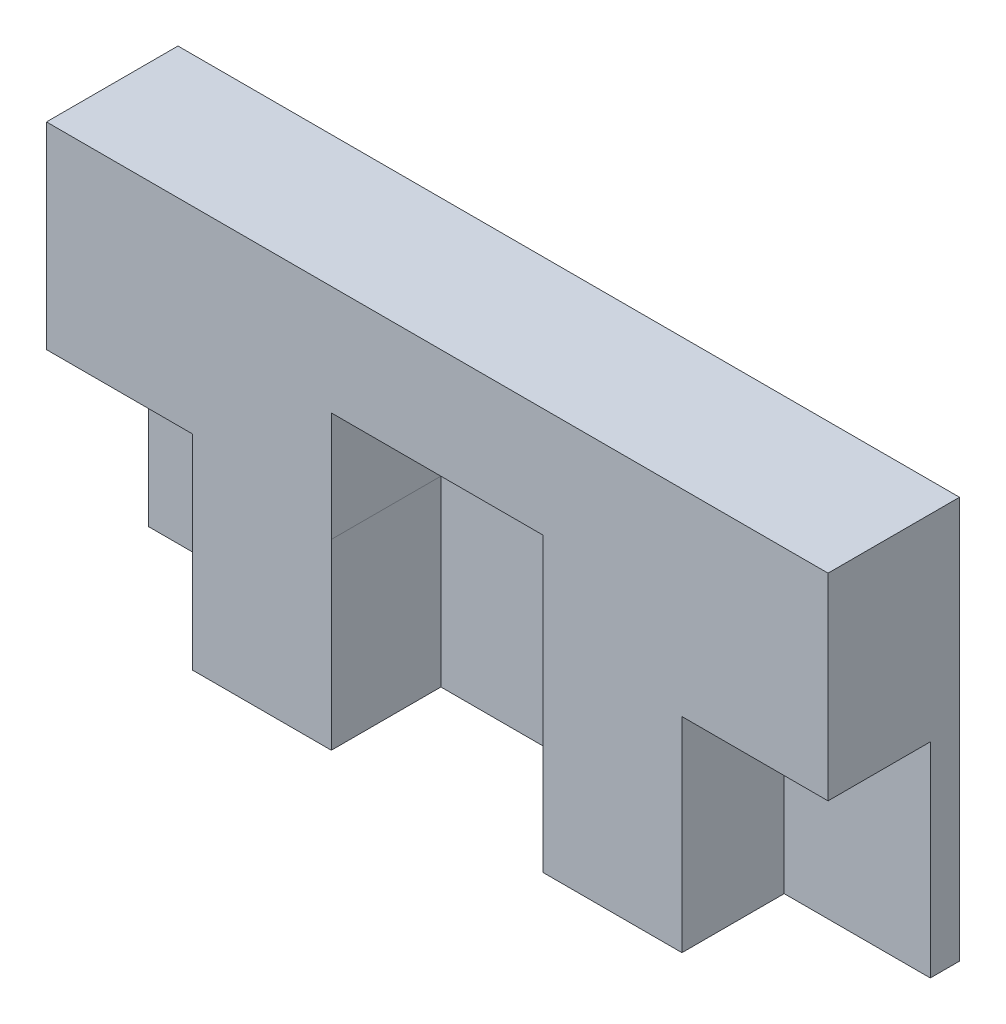
ISO-10303-21;
HEADER;
FILE_DESCRIPTION(('STEP AP214'),'2;1');
FILE_NAME('part.step','',(''),(''),'','','');
FILE_SCHEMA(('AUTOMOTIVE_DESIGN { 1 0 10303 214 1 1 1 1 }'));
ENDSEC;
DATA;
#1=APPLICATION_CONTEXT('core data for automotive mechanical design processes');
#2=APPLICATION_PROTOCOL_DEFINITION('international standard','automotive_design',2000,#1);
#3=PRODUCT_CONTEXT('',#1,'mechanical');
#4=PRODUCT('Part','Part','',(#3));
#5=PRODUCT_RELATED_PRODUCT_CATEGORY('part','',(#4));
#6=PRODUCT_DEFINITION_FORMATION('','',#4);
#7=PRODUCT_DEFINITION_CONTEXT('part definition',#1,'design');
#8=PRODUCT_DEFINITION('design','',#6,#7);
#9=PRODUCT_DEFINITION_SHAPE('','',#8);
#10=(LENGTH_UNIT() NAMED_UNIT(*) SI_UNIT(.MILLI.,.METRE.));
#11=(NAMED_UNIT(*) PLANE_ANGLE_UNIT() SI_UNIT($,.RADIAN.));
#12=(NAMED_UNIT(*) SI_UNIT($,.STERADIAN.) SOLID_ANGLE_UNIT());
#13=UNCERTAINTY_MEASURE_WITH_UNIT(LENGTH_MEASURE(1.E-05),#10,'distance_accuracy_value','');
#14=(GEOMETRIC_REPRESENTATION_CONTEXT(3) GLOBAL_UNCERTAINTY_ASSIGNED_CONTEXT((#13)) GLOBAL_UNIT_ASSIGNED_CONTEXT((#10,
#11,#12)) REPRESENTATION_CONTEXT('',''));
#15=CARTESIAN_POINT('',(0.,0.,0.));
#16=DIRECTION('',(0.,0.,1.));
#17=DIRECTION('',(1.,0.,0.));
#18=AXIS2_PLACEMENT_3D('',#15,#16,#17);
#19=CARTESIAN_POINT('',(-339.725,349.25,0.));
#20=DIRECTION('',(1.,0.,0.));
#21=DIRECTION('',(0.,0.,-1.));
#22=AXIS2_PLACEMENT_3D('',#19,#20,#21);
#23=PLANE('',#22);
#24=DIRECTION('',(0.,-1.,0.));
#25=VECTOR('',#24,1.);
#26=CARTESIAN_POINT('',(-339.725,177.8,-88.9));
#27=LINE('',#26,#25);
#28=CARTESIAN_POINT('',(-339.725,177.8,-88.9));
#29=VERTEX_POINT('',#28);
#30=CARTESIAN_POINT('',(-339.725,0.,-88.9));
#31=VERTEX_POINT('',#30);
#32=EDGE_CURVE('E60',#29,#31,#27,.T.);
#33=ORIENTED_EDGE('',*,*,#32,.F.);
#34=DIRECTION('',(0.,0.,1.));
#35=VECTOR('',#34,1.);
#36=CARTESIAN_POINT('',(-339.725,177.8,0.));
#37=LINE('',#36,#35);
#38=CARTESIAN_POINT('',(-339.725,177.8,0.));
#39=VERTEX_POINT('',#38);
#40=EDGE_CURVE('E151',#29,#39,#37,.T.);
#41=ORIENTED_EDGE('',*,*,#40,.T.);
#42=DIRECTION('',(0.,-1.,0.));
#43=VECTOR('',#42,1.);
#44=CARTESIAN_POINT('',(-339.725,349.25,0.));
#45=LINE('',#44,#43);
#46=CARTESIAN_POINT('',(-339.725,349.25,0.));
#47=VERTEX_POINT('',#46);
#48=EDGE_CURVE('E11',#47,#39,#45,.T.);
#49=ORIENTED_EDGE('',*,*,#48,.F.);
#50=DIRECTION('',(0.,0.,1.));
#51=VECTOR('',#50,1.);
#52=CARTESIAN_POINT('',(-339.725,349.25,0.));
#53=LINE('',#52,#51);
#54=CARTESIAN_POINT('',(-339.725,349.25,-114.3));
#55=VERTEX_POINT('',#54);
#56=EDGE_CURVE('E171',#55,#47,#53,.T.);
#57=ORIENTED_EDGE('',*,*,#56,.F.);
#58=DIRECTION('',(0.,-1.,0.));
#59=VECTOR('',#58,1.);
#60=CARTESIAN_POINT('',(-339.725,349.25,-114.3));
#61=LINE('',#60,#59);
#62=CARTESIAN_POINT('',(-339.725,0.,-114.3));
#63=VERTEX_POINT('',#62);
#64=EDGE_CURVE('E188',#55,#63,#61,.T.);
#65=ORIENTED_EDGE('',*,*,#64,.T.);
#66=DIRECTION('',(0.,0.,1.));
#67=VECTOR('',#66,1.);
#68=CARTESIAN_POINT('',(-339.725,0.,0.));
#69=LINE('',#68,#67);
#70=EDGE_CURVE('E189',#63,#31,#69,.T.);
#71=ORIENTED_EDGE('',*,*,#70,.T.);
#72=EDGE_LOOP('',(#33,#41,#49,#57,#65,#71));
#73=FACE_BOUND('',#72,.T.);
#74=ADVANCED_FACE('F38',(#73),#23,.F.);
#75=CARTESIAN_POINT('',(-339.725,349.25,0.));
#76=DIRECTION('',(0.,0.,-1.));
#77=DIRECTION('',(-1.,0.,0.));
#78=AXIS2_PLACEMENT_3D('',#75,#76,#77);
#79=PLANE('',#78);
#80=DIRECTION('',(0.,-1.,0.));
#81=VECTOR('',#80,1.);
#82=CARTESIAN_POINT('',(-212.725,177.8,0.));
#83=LINE('',#82,#81);
#84=CARTESIAN_POINT('',(-212.725,177.8,0.));
#85=VERTEX_POINT('',#84);
#86=CARTESIAN_POINT('',(-212.725,0.,0.));
#87=VERTEX_POINT('',#86);
#88=EDGE_CURVE('E225',#85,#87,#83,.T.);
#89=ORIENTED_EDGE('',*,*,#88,.T.);
#90=DIRECTION('',(1.,0.,0.));
#91=VECTOR('',#90,1.);
#92=CARTESIAN_POINT('',(-339.725,0.,0.));
#93=LINE('',#92,#91);
#94=CARTESIAN_POINT('',(-92.075,0.,0.));
#95=VERTEX_POINT('',#94);
#96=EDGE_CURVE('E193',#87,#95,#93,.T.);
#97=ORIENTED_EDGE('',*,*,#96,.T.);
#98=DIRECTION('',(0.,1.,0.));
#99=VECTOR('',#98,1.);
#100=CARTESIAN_POINT('',(-92.075,-1.5875,0.));
#101=LINE('',#100,#99);
#102=CARTESIAN_POINT('',(-92.075,158.75,-1.11022302462516E-13));
#103=VERTEX_POINT('',#102);
#104=EDGE_CURVE('E274',#95,#103,#101,.T.);
#105=ORIENTED_EDGE('',*,*,#104,.T.);
#106=DIRECTION('',(0.,-1.,0.));
#107=VECTOR('',#106,1.);
#108=CARTESIAN_POINT('',(-92.075,158.75,0.));
#109=LINE('',#108,#107);
#110=CARTESIAN_POINT('',(-92.075,254.,0.));
#111=VERTEX_POINT('',#110);
#112=EDGE_CURVE('E192',#111,#103,#109,.T.);
#113=ORIENTED_EDGE('',*,*,#112,.F.);
#114=DIRECTION('',(-1.,0.,0.));
#115=VECTOR('',#114,1.);
#116=CARTESIAN_POINT('',(-92.075,254.,0.));
#117=LINE('',#116,#115);
#118=CARTESIAN_POINT('',(92.075,254.,0.));
#119=VERTEX_POINT('',#118);
#120=EDGE_CURVE('E245',#119,#111,#117,.T.);
#121=ORIENTED_EDGE('',*,*,#120,.F.);
#122=DIRECTION('',(0.,1.,0.));
#123=VECTOR('',#122,1.);
#124=CARTESIAN_POINT('',(92.075,158.75,0.));
#125=LINE('',#124,#123);
#126=CARTESIAN_POINT('',(92.075,158.75,0.));
#127=VERTEX_POINT('',#126);
#128=EDGE_CURVE('E249',#127,#119,#125,.T.);
#129=ORIENTED_EDGE('',*,*,#128,.F.);
#130=DIRECTION('',(0.,1.,0.));
#131=VECTOR('',#130,1.);
#132=CARTESIAN_POINT('',(92.075,-1.5875,0.));
#133=LINE('',#132,#131);
#134=CARTESIAN_POINT('',(92.075,0.,0.));
#135=VERTEX_POINT('',#134);
#136=EDGE_CURVE('E183',#135,#127,#133,.T.);
#137=ORIENTED_EDGE('',*,*,#136,.F.);
#138=CARTESIAN_POINT('',(212.725,0.,0.));
#139=VERTEX_POINT('',#138);
#140=EDGE_CURVE('E191',#135,#139,#93,.T.);
#141=ORIENTED_EDGE('',*,*,#140,.T.);
#142=DIRECTION('',(0.,-1.,0.));
#143=VECTOR('',#142,1.);
#144=CARTESIAN_POINT('',(212.725,177.8,0.));
#145=LINE('',#144,#143);
#146=CARTESIAN_POINT('',(212.725,177.8,0.));
#147=VERTEX_POINT('',#146);
#148=EDGE_CURVE('E52',#147,#139,#145,.T.);
#149=ORIENTED_EDGE('',*,*,#148,.F.);
#150=DIRECTION('',(1.,0.,0.));
#151=VECTOR('',#150,1.);
#152=CARTESIAN_POINT('',(339.725,177.8,0.));
#153=LINE('',#152,#151);
#154=CARTESIAN_POINT('',(339.725,177.8,0.));
#155=VERTEX_POINT('',#154);
#156=EDGE_CURVE('E234',#147,#155,#153,.T.);
#157=ORIENTED_EDGE('',*,*,#156,.T.);
#158=DIRECTION('',(0.,-1.,0.));
#159=VECTOR('',#158,1.);
#160=CARTESIAN_POINT('',(339.725,349.25,0.));
#161=LINE('',#160,#159);
#162=CARTESIAN_POINT('',(339.725,349.25,0.));
#163=VERTEX_POINT('',#162);
#164=EDGE_CURVE('E45',#163,#155,#161,.T.);
#165=ORIENTED_EDGE('',*,*,#164,.F.);
#166=DIRECTION('',(1.,0.,0.));
#167=VECTOR('',#166,1.);
#168=CARTESIAN_POINT('',(-339.725,349.25,0.));
#169=LINE('',#168,#167);
#170=EDGE_CURVE('E164',#47,#163,#169,.T.);
#171=ORIENTED_EDGE('',*,*,#170,.F.);
#172=ORIENTED_EDGE('',*,*,#48,.T.);
#173=DIRECTION('',(1.,0.,0.));
#174=VECTOR('',#173,1.);
#175=CARTESIAN_POINT('',(-339.725,177.8,0.));
#176=LINE('',#175,#174);
#177=EDGE_CURVE('E147',#39,#85,#176,.T.);
#178=ORIENTED_EDGE('',*,*,#177,.T.);
#179=EDGE_LOOP('',(#89,#97,#105,#113,#121,#129,#137,#141,#149,#157,#165,#171,#172,#178));
#180=FACE_BOUND('',#179,.T.);
#181=ADVANCED_FACE('F162',(#180),#79,.F.);
#182=CARTESIAN_POINT('',(339.725,349.25,0.));
#183=DIRECTION('',(-1.,0.,0.));
#184=DIRECTION('',(0.,0.,1.));
#185=AXIS2_PLACEMENT_3D('',#182,#183,#184);
#186=PLANE('',#185);
#187=DIRECTION('',(0.,-1.,0.));
#188=VECTOR('',#187,1.);
#189=CARTESIAN_POINT('',(339.725,177.8,-88.8999999999999));
#190=LINE('',#189,#188);
#191=CARTESIAN_POINT('',(339.725,177.8,-88.8999999999999));
#192=VERTEX_POINT('',#191);
#193=CARTESIAN_POINT('',(339.725,0.,-88.8999999999999));
#194=VERTEX_POINT('',#193);
#195=EDGE_CURVE('E217',#192,#194,#190,.T.);
#196=ORIENTED_EDGE('',*,*,#195,.T.);
#197=DIRECTION('',(0.,0.,-1.));
#198=VECTOR('',#197,1.);
#199=CARTESIAN_POINT('',(339.725,0.,0.));
#200=LINE('',#199,#198);
#201=CARTESIAN_POINT('',(339.725,0.,-114.3));
#202=VERTEX_POINT('',#201);
#203=EDGE_CURVE('E180',#194,#202,#200,.T.);
#204=ORIENTED_EDGE('',*,*,#203,.T.);
#205=DIRECTION('',(0.,-1.,0.));
#206=VECTOR('',#205,1.);
#207=CARTESIAN_POINT('',(339.725,349.25,-114.3));
#208=LINE('',#207,#206);
#209=CARTESIAN_POINT('',(339.725,349.25,-114.3));
#210=VERTEX_POINT('',#209);
#211=EDGE_CURVE('E197',#210,#202,#208,.T.);
#212=ORIENTED_EDGE('',*,*,#211,.F.);
#213=DIRECTION('',(0.,0.,-1.));
#214=VECTOR('',#213,1.);
#215=CARTESIAN_POINT('',(339.725,349.25,0.));
#216=LINE('',#215,#214);
#217=EDGE_CURVE('E170',#163,#210,#216,.T.);
#218=ORIENTED_EDGE('',*,*,#217,.F.);
#219=ORIENTED_EDGE('',*,*,#164,.T.);
#220=DIRECTION('',(0.,0.,-1.));
#221=VECTOR('',#220,1.);
#222=CARTESIAN_POINT('',(339.725,177.8,0.));
#223=LINE('',#222,#221);
#224=EDGE_CURVE('E203',#155,#192,#223,.T.);
#225=ORIENTED_EDGE('',*,*,#224,.T.);
#226=EDGE_LOOP('',(#196,#204,#212,#218,#219,#225));
#227=FACE_BOUND('',#226,.T.);
#228=ADVANCED_FACE('F202',(#227),#186,.F.);
#229=CARTESIAN_POINT('',(0.,0.,0.));
#230=DIRECTION('',(0.,-1.,0.));
#231=DIRECTION('',(0.,0.,-1.));
#232=AXIS2_PLACEMENT_3D('',#229,#230,#231);
#233=PLANE('',#232);
#234=ORIENTED_EDGE('',*,*,#96,.F.);
#235=DIRECTION('',(0.,0.,-1.));
#236=VECTOR('',#235,1.);
#237=CARTESIAN_POINT('',(-212.725,0.,0.));
#238=LINE('',#237,#236);
#239=CARTESIAN_POINT('',(-212.725,0.,-88.9));
#240=VERTEX_POINT('',#239);
#241=EDGE_CURVE('E214',#87,#240,#238,.T.);
#242=ORIENTED_EDGE('',*,*,#241,.T.);
#243=DIRECTION('',(-1.,0.,0.));
#244=VECTOR('',#243,1.);
#245=CARTESIAN_POINT('',(-339.725,0.,-88.9));
#246=LINE('',#245,#244);
#247=EDGE_CURVE('E160',#240,#31,#246,.T.);
#248=ORIENTED_EDGE('',*,*,#247,.T.);
#249=ORIENTED_EDGE('',*,*,#70,.F.);
#250=DIRECTION('',(-1.,0.,0.));
#251=VECTOR('',#250,1.);
#252=CARTESIAN_POINT('',(-339.725,0.,-114.3));
#253=LINE('',#252,#251);
#254=EDGE_CURVE('E178',#202,#63,#253,.T.);
#255=ORIENTED_EDGE('',*,*,#254,.F.);
#256=ORIENTED_EDGE('',*,*,#203,.F.);
#257=DIRECTION('',(-1.,0.,0.));
#258=VECTOR('',#257,1.);
#259=CARTESIAN_POINT('',(339.725,0.,-88.8999999999999));
#260=LINE('',#259,#258);
#261=CARTESIAN_POINT('',(212.725,0.,-88.8999999999999));
#262=VERTEX_POINT('',#261);
#263=EDGE_CURVE('E236',#194,#262,#260,.T.);
#264=ORIENTED_EDGE('',*,*,#263,.T.);
#265=DIRECTION('',(0.,0.,1.));
#266=VECTOR('',#265,1.);
#267=CARTESIAN_POINT('',(212.725,0.,0.));
#268=LINE('',#267,#266);
#269=EDGE_CURVE('E230',#262,#139,#268,.T.);
#270=ORIENTED_EDGE('',*,*,#269,.T.);
#271=ORIENTED_EDGE('',*,*,#140,.F.);
#272=DIRECTION('',(0.,0.,-1.));
#273=VECTOR('',#272,1.);
#274=CARTESIAN_POINT('',(92.075,0.,0.));
#275=LINE('',#274,#273);
#276=CARTESIAN_POINT('',(92.075,0.,-95.2499999999999));
#277=VERTEX_POINT('',#276);
#278=EDGE_CURVE('E227',#135,#277,#275,.T.);
#279=ORIENTED_EDGE('',*,*,#278,.T.);
#280=DIRECTION('',(-1.,0.,0.));
#281=VECTOR('',#280,1.);
#282=CARTESIAN_POINT('',(-92.075,0.,-95.2499999999999));
#283=LINE('',#282,#281);
#284=CARTESIAN_POINT('',(-92.075,0.,-95.25));
#285=VERTEX_POINT('',#284);
#286=EDGE_CURVE('E267',#277,#285,#283,.T.);
#287=ORIENTED_EDGE('',*,*,#286,.T.);
#288=DIRECTION('',(0.,0.,1.));
#289=VECTOR('',#288,1.);
#290=CARTESIAN_POINT('',(-92.075,0.,0.));
#291=LINE('',#290,#289);
#292=EDGE_CURVE('E271',#285,#95,#291,.T.);
#293=ORIENTED_EDGE('',*,*,#292,.T.);
#294=EDGE_LOOP('',(#234,#242,#248,#249,#255,#256,#264,#270,#271,#279,#287,#293));
#295=FACE_BOUND('',#294,.T.);
#296=ADVANCED_FACE('F212',(#295),#233,.T.);
#297=CARTESIAN_POINT('',(-339.725,349.25,-114.3));
#298=DIRECTION('',(0.,0.,1.));
#299=DIRECTION('',(1.,0.,0.));
#300=AXIS2_PLACEMENT_3D('',#297,#298,#299);
#301=PLANE('',#300);
#302=ORIENTED_EDGE('',*,*,#254,.T.);
#303=ORIENTED_EDGE('',*,*,#64,.F.);
#304=DIRECTION('',(-1.,0.,0.));
#305=VECTOR('',#304,1.);
#306=CARTESIAN_POINT('',(-339.725,349.25,-114.3));
#307=LINE('',#306,#305);
#308=EDGE_CURVE('E175',#210,#55,#307,.T.);
#309=ORIENTED_EDGE('',*,*,#308,.F.);
#310=ORIENTED_EDGE('',*,*,#211,.T.);
#311=EDGE_LOOP('',(#302,#303,#309,#310));
#312=FACE_BOUND('',#311,.T.);
#313=ADVANCED_FACE('F208',(#312),#301,.F.);
#314=CARTESIAN_POINT('',(0.,349.25,0.));
#315=DIRECTION('',(0.,-1.,0.));
#316=DIRECTION('',(0.,0.,-1.));
#317=AXIS2_PLACEMENT_3D('',#314,#315,#316);
#318=PLANE('',#317);
#319=ORIENTED_EDGE('',*,*,#56,.T.);
#320=ORIENTED_EDGE('',*,*,#170,.T.);
#321=ORIENTED_EDGE('',*,*,#217,.T.);
#322=ORIENTED_EDGE('',*,*,#308,.T.);
#323=EDGE_LOOP('',(#319,#320,#321,#322));
#324=FACE_BOUND('',#323,.T.);
#325=ADVANCED_FACE('F173',(#324),#318,.F.);
#326=CARTESIAN_POINT('',(92.075,-1.5875,0.));
#327=DIRECTION('',(1.,0.,0.));
#328=DIRECTION('',(0.,0.,-1.));
#329=AXIS2_PLACEMENT_3D('',#326,#327,#328);
#330=PLANE('',#329);
#331=ORIENTED_EDGE('',*,*,#136,.T.);
#332=DIRECTION('',(0.,0.,-1.));
#333=VECTOR('',#332,1.);
#334=CARTESIAN_POINT('',(92.075,158.75,0.));
#335=LINE('',#334,#333);
#336=CARTESIAN_POINT('',(92.075,158.75,-95.25));
#337=VERTEX_POINT('',#336);
#338=EDGE_CURVE('E253',#127,#337,#335,.T.);
#339=ORIENTED_EDGE('',*,*,#338,.T.);
#340=DIRECTION('',(0.,1.,0.));
#341=VECTOR('',#340,1.);
#342=CARTESIAN_POINT('',(92.075,-1.5875,-95.2499999999999));
#343=LINE('',#342,#341);
#344=EDGE_CURVE('E266',#277,#337,#343,.T.);
#345=ORIENTED_EDGE('',*,*,#344,.F.);
#346=ORIENTED_EDGE('',*,*,#278,.F.);
#347=EDGE_LOOP('',(#331,#339,#345,#346));
#348=FACE_BOUND('',#347,.T.);
#349=ADVANCED_FACE('F293',(#348),#330,.F.);
#350=CARTESIAN_POINT('',(-92.075,-1.5875,-95.2499999999999));
#351=DIRECTION('',(0.,0.,-1.));
#352=DIRECTION('',(0.,1.,0.));
#353=AXIS2_PLACEMENT_3D('',#350,#351,#352);
#354=PLANE('',#353);
#355=ORIENTED_EDGE('',*,*,#344,.T.);
#356=DIRECTION('',(-1.,0.,0.));
#357=VECTOR('',#356,1.);
#358=CARTESIAN_POINT('',(-92.075,158.75,-95.25));
#359=LINE('',#358,#357);
#360=CARTESIAN_POINT('',(-92.075,158.75,-95.25));
#361=VERTEX_POINT('',#360);
#362=EDGE_CURVE('E250',#337,#361,#359,.T.);
#363=ORIENTED_EDGE('',*,*,#362,.T.);
#364=DIRECTION('',(0.,1.,0.));
#365=VECTOR('',#364,1.);
#366=CARTESIAN_POINT('',(-92.075,-1.5875,-95.2499999999999));
#367=LINE('',#366,#365);
#368=EDGE_CURVE('E270',#285,#361,#367,.T.);
#369=ORIENTED_EDGE('',*,*,#368,.F.);
#370=ORIENTED_EDGE('',*,*,#286,.F.);
#371=EDGE_LOOP('',(#355,#363,#369,#370));
#372=FACE_BOUND('',#371,.T.);
#373=ADVANCED_FACE('F280',(#372),#354,.F.);
#374=CARTESIAN_POINT('',(-92.075,-1.5875,0.));
#375=DIRECTION('',(-1.,0.,0.));
#376=DIRECTION('',(0.,0.,1.));
#377=AXIS2_PLACEMENT_3D('',#374,#375,#376);
#378=PLANE('',#377);
#379=ORIENTED_EDGE('',*,*,#368,.T.);
#380=DIRECTION('',(0.,0.,1.));
#381=VECTOR('',#380,1.);
#382=CARTESIAN_POINT('',(-92.075,158.75,0.));
#383=LINE('',#382,#381);
#384=EDGE_CURVE('E246',#361,#103,#383,.T.);
#385=ORIENTED_EDGE('',*,*,#384,.T.);
#386=ORIENTED_EDGE('',*,*,#104,.F.);
#387=ORIENTED_EDGE('',*,*,#292,.F.);
#388=EDGE_LOOP('',(#379,#385,#386,#387));
#389=FACE_BOUND('',#388,.T.);
#390=ADVANCED_FACE('F316',(#389),#378,.F.);
#391=CARTESIAN_POINT('',(92.075,158.75,0.));
#392=DIRECTION('',(1.,0.,0.));
#393=DIRECTION('',(0.,0.,-1.));
#394=AXIS2_PLACEMENT_3D('',#391,#392,#393);
#395=PLANE('',#394);
#396=CARTESIAN_POINT('',(92.075,158.75,0.));
#397=DIRECTION('',(1.,0.,0.));
#398=DIRECTION('',(0.,0.,-1.));
#399=AXIS2_PLACEMENT_3D('',#396,#397,#398);
#400=CIRCLE('',#399,95.2499999999999);
#401=EDGE_CURVE('E258',#337,#119,#400,.T.);
#402=ORIENTED_EDGE('',*,*,#401,.F.);
#403=ORIENTED_EDGE('',*,*,#338,.F.);
#404=ORIENTED_EDGE('',*,*,#128,.T.);
#405=EDGE_LOOP('',(#402,#403,#404));
#406=FACE_BOUND('',#405,.T.);
#407=ADVANCED_FACE('F286',(#406),#395,.F.);
#408=CARTESIAN_POINT('',(0.,158.75,0.));
#409=DIRECTION('',(1.,0.,0.));
#410=DIRECTION('',(0.,0.,-1.));
#411=AXIS2_PLACEMENT_3D('',#408,#409,#410);
#412=CYLINDRICAL_SURFACE('',#411,95.2499999999999);
#413=CARTESIAN_POINT('',(-92.075,158.75,0.));
#414=DIRECTION('',(1.,0.,0.));
#415=DIRECTION('',(0.,0.,-1.));
#416=AXIS2_PLACEMENT_3D('',#413,#414,#415);
#417=CIRCLE('',#416,95.2499999999999);
#418=EDGE_CURVE('E251',#361,#111,#417,.T.);
#419=ORIENTED_EDGE('',*,*,#418,.F.);
#420=ORIENTED_EDGE('',*,*,#362,.F.);
#421=ORIENTED_EDGE('',*,*,#401,.T.);
#422=ORIENTED_EDGE('',*,*,#120,.T.);
#423=EDGE_LOOP('',(#419,#420,#421,#422));
#424=FACE_BOUND('',#423,.T.);
#425=ADVANCED_FACE('F291',(#424),#412,.F.);
#426=CARTESIAN_POINT('',(-92.075,158.75,0.));
#427=DIRECTION('',(-1.,0.,0.));
#428=DIRECTION('',(0.,0.,1.));
#429=AXIS2_PLACEMENT_3D('',#426,#427,#428);
#430=PLANE('',#429);
#431=ORIENTED_EDGE('',*,*,#384,.F.);
#432=ORIENTED_EDGE('',*,*,#418,.T.);
#433=ORIENTED_EDGE('',*,*,#112,.T.);
#434=EDGE_LOOP('',(#431,#432,#433));
#435=FACE_BOUND('',#434,.T.);
#436=ADVANCED_FACE('F307',(#435),#430,.F.);
#437=CARTESIAN_POINT('',(339.725,177.8,-88.8999999999999));
#438=DIRECTION('',(0.,0.,1.));
#439=DIRECTION('',(1.,0.,0.));
#440=AXIS2_PLACEMENT_3D('',#437,#438,#439);
#441=PLANE('',#440);
#442=ORIENTED_EDGE('',*,*,#263,.F.);
#443=ORIENTED_EDGE('',*,*,#195,.F.);
#444=DIRECTION('',(-1.,0.,0.));
#445=VECTOR('',#444,1.);
#446=CARTESIAN_POINT('',(339.725,177.8,-88.8999999999999));
#447=LINE('',#446,#445);
#448=CARTESIAN_POINT('',(212.725,177.8,-88.8999999999999));
#449=VERTEX_POINT('',#448);
#450=EDGE_CURVE('E229',#192,#449,#447,.T.);
#451=ORIENTED_EDGE('',*,*,#450,.T.);
#452=DIRECTION('',(0.,-1.,0.));
#453=VECTOR('',#452,1.);
#454=CARTESIAN_POINT('',(212.725,177.8,-88.8999999999999));
#455=LINE('',#454,#453);
#456=EDGE_CURVE('E241',#449,#262,#455,.T.);
#457=ORIENTED_EDGE('',*,*,#456,.T.);
#458=EDGE_LOOP('',(#442,#443,#451,#457));
#459=FACE_BOUND('',#458,.T.);
#460=ADVANCED_FACE('F305',(#459),#441,.T.);
#461=CARTESIAN_POINT('',(212.725,177.8,0.));
#462=DIRECTION('',(1.,0.,0.));
#463=DIRECTION('',(0.,0.,-1.));
#464=AXIS2_PLACEMENT_3D('',#461,#462,#463);
#465=PLANE('',#464);
#466=ORIENTED_EDGE('',*,*,#269,.F.);
#467=ORIENTED_EDGE('',*,*,#456,.F.);
#468=DIRECTION('',(0.,0.,1.));
#469=VECTOR('',#468,1.);
#470=CARTESIAN_POINT('',(212.725,177.8,0.));
#471=LINE('',#470,#469);
#472=EDGE_CURVE('E232',#449,#147,#471,.T.);
#473=ORIENTED_EDGE('',*,*,#472,.T.);
#474=ORIENTED_EDGE('',*,*,#148,.T.);
#475=EDGE_LOOP('',(#466,#467,#473,#474));
#476=FACE_BOUND('',#475,.T.);
#477=ADVANCED_FACE('F298',(#476),#465,.T.);
#478=CARTESIAN_POINT('',(0.,177.8,0.));
#479=DIRECTION('',(0.,1.,0.));
#480=DIRECTION('',(0.,0.,1.));
#481=AXIS2_PLACEMENT_3D('',#478,#479,#480);
#482=PLANE('',#481);
#483=ORIENTED_EDGE('',*,*,#224,.F.);
#484=ORIENTED_EDGE('',*,*,#156,.F.);
#485=ORIENTED_EDGE('',*,*,#472,.F.);
#486=ORIENTED_EDGE('',*,*,#450,.F.);
#487=EDGE_LOOP('',(#483,#484,#485,#486));
#488=FACE_BOUND('',#487,.T.);
#489=ADVANCED_FACE('F303',(#488),#482,.F.);
#490=CARTESIAN_POINT('',(-212.725,177.8,0.));
#491=DIRECTION('',(-1.,0.,0.));
#492=DIRECTION('',(0.,0.,1.));
#493=AXIS2_PLACEMENT_3D('',#490,#491,#492);
#494=PLANE('',#493);
#495=ORIENTED_EDGE('',*,*,#241,.F.);
#496=ORIENTED_EDGE('',*,*,#88,.F.);
#497=DIRECTION('',(0.,0.,-1.));
#498=VECTOR('',#497,1.);
#499=CARTESIAN_POINT('',(-212.725,177.8,0.));
#500=LINE('',#499,#498);
#501=CARTESIAN_POINT('',(-212.725,177.8,-88.9));
#502=VERTEX_POINT('',#501);
#503=EDGE_CURVE('E152',#85,#502,#500,.T.);
#504=ORIENTED_EDGE('',*,*,#503,.T.);
#505=DIRECTION('',(0.,-1.,0.));
#506=VECTOR('',#505,1.);
#507=CARTESIAN_POINT('',(-212.725,177.8,-88.9));
#508=LINE('',#507,#506);
#509=EDGE_CURVE('E222',#502,#240,#508,.T.);
#510=ORIENTED_EDGE('',*,*,#509,.T.);
#511=EDGE_LOOP('',(#495,#496,#504,#510));
#512=FACE_BOUND('',#511,.T.);
#513=ADVANCED_FACE('F389',(#512),#494,.T.);
#514=CARTESIAN_POINT('',(-339.725,177.8,-88.9));
#515=DIRECTION('',(0.,0.,1.));
#516=DIRECTION('',(1.,0.,0.));
#517=AXIS2_PLACEMENT_3D('',#514,#515,#516);
#518=PLANE('',#517);
#519=ORIENTED_EDGE('',*,*,#247,.F.);
#520=ORIENTED_EDGE('',*,*,#509,.F.);
#521=DIRECTION('',(-1.,0.,0.));
#522=VECTOR('',#521,1.);
#523=CARTESIAN_POINT('',(-339.725,177.8,-88.9));
#524=LINE('',#523,#522);
#525=EDGE_CURVE('E223',#502,#29,#524,.T.);
#526=ORIENTED_EDGE('',*,*,#525,.T.);
#527=ORIENTED_EDGE('',*,*,#32,.T.);
#528=EDGE_LOOP('',(#519,#520,#526,#527));
#529=FACE_BOUND('',#528,.T.);
#530=ADVANCED_FACE('F398',(#529),#518,.T.);
#531=CARTESIAN_POINT('',(0.,177.8,0.));
#532=DIRECTION('',(0.,-1.,0.));
#533=DIRECTION('',(0.,0.,-1.));
#534=AXIS2_PLACEMENT_3D('',#531,#532,#533);
#535=PLANE('',#534);
#536=ORIENTED_EDGE('',*,*,#40,.F.);
#537=ORIENTED_EDGE('',*,*,#525,.F.);
#538=ORIENTED_EDGE('',*,*,#503,.F.);
#539=ORIENTED_EDGE('',*,*,#177,.F.);
#540=EDGE_LOOP('',(#536,#537,#538,#539));
#541=FACE_BOUND('',#540,.T.);
#542=ADVANCED_FACE('F149',(#541),#535,.T.);
#543=CLOSED_SHELL('',(#74,#181,#228,#296,#313,#325,#349,#373,#390,#407,#425,#436,#460,#477,#489,
#513,#530,#542));
#544=MANIFOLD_SOLID_BREP('B2',#543);
#545=ADVANCED_BREP_SHAPE_REPRESENTATION('',(#18,#544),#14);
#546=SHAPE_DEFINITION_REPRESENTATION(#9,#545);
ENDSEC;
END-ISO-10303-21;
